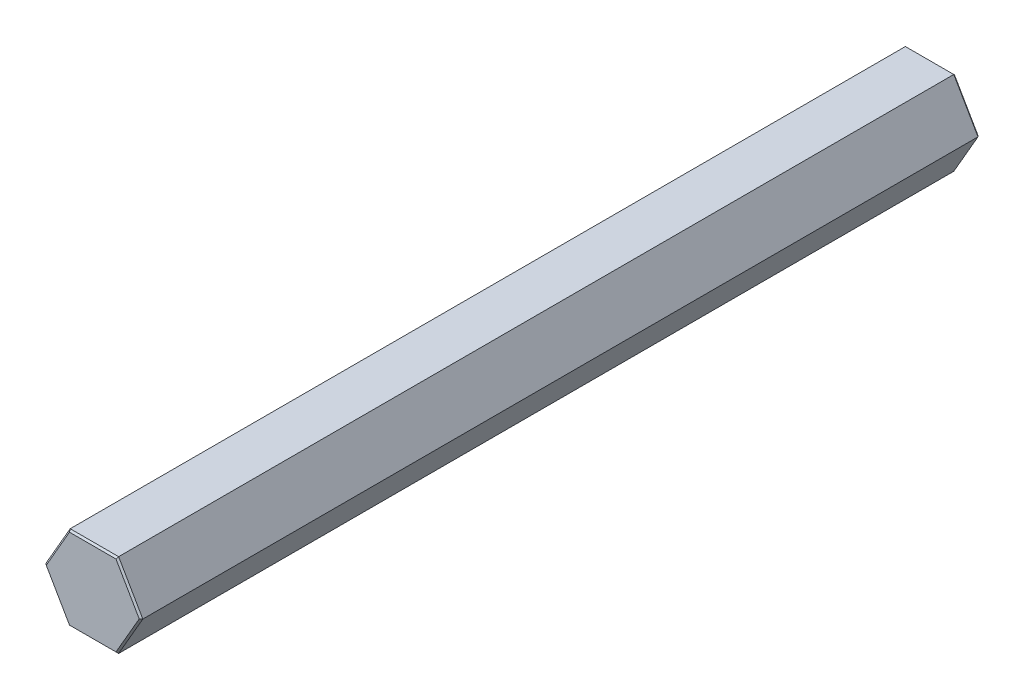
ISO-10303-21;
HEADER;
FILE_DESCRIPTION(('STEP AP214'),'2;1');
FILE_NAME('part.step','',(''),(''),'','','');
FILE_SCHEMA(('AUTOMOTIVE_DESIGN { 1 0 10303 214 1 1 1 1 }'));
ENDSEC;
DATA;
#1=APPLICATION_CONTEXT('core data for automotive mechanical design processes');
#2=APPLICATION_PROTOCOL_DEFINITION('international standard','automotive_design',2000,#1);
#3=PRODUCT_CONTEXT('',#1,'mechanical');
#4=PRODUCT('Part','Part','',(#3));
#5=PRODUCT_RELATED_PRODUCT_CATEGORY('part','',(#4));
#6=PRODUCT_DEFINITION_FORMATION('','',#4);
#7=PRODUCT_DEFINITION_CONTEXT('part definition',#1,'design');
#8=PRODUCT_DEFINITION('design','',#6,#7);
#9=PRODUCT_DEFINITION_SHAPE('','',#8);
#10=(LENGTH_UNIT() NAMED_UNIT(*) SI_UNIT(.MILLI.,.METRE.));
#11=(NAMED_UNIT(*) PLANE_ANGLE_UNIT() SI_UNIT($,.RADIAN.));
#12=(NAMED_UNIT(*) SI_UNIT($,.STERADIAN.) SOLID_ANGLE_UNIT());
#13=UNCERTAINTY_MEASURE_WITH_UNIT(LENGTH_MEASURE(1.E-05),#10,'distance_accuracy_value','');
#14=(GEOMETRIC_REPRESENTATION_CONTEXT(3) GLOBAL_UNCERTAINTY_ASSIGNED_CONTEXT((#13)) GLOBAL_UNIT_ASSIGNED_CONTEXT((#10,
#11,#12)) REPRESENTATION_CONTEXT('',''));
#15=CARTESIAN_POINT('',(0.,0.,0.));
#16=DIRECTION('',(0.,0.,1.));
#17=DIRECTION('',(1.,0.,0.));
#18=AXIS2_PLACEMENT_3D('',#15,#16,#17);
#19=CARTESIAN_POINT('',(-3.66617420935412,-6.35,0.));
#20=DIRECTION('',(0.,-1.,0.));
#21=DIRECTION('',(1.,0.,0.));
#22=AXIS2_PLACEMENT_3D('',#19,#20,#21);
#23=PLANE('',#22);
#24=DIRECTION('',(0.,0.,1.));
#25=VECTOR('',#24,1.);
#26=CARTESIAN_POINT('',(-3.66617420935412,-6.35,0.));
#27=LINE('',#26,#25);
#28=CARTESIAN_POINT('',(-3.66617420935412,-6.35,0.254000000000032));
#29=VERTEX_POINT('',#28);
#30=CARTESIAN_POINT('',(-3.66617420935412,-6.35,126.746));
#31=VERTEX_POINT('',#30);
#32=EDGE_CURVE('E169',#29,#31,#27,.T.);
#33=ORIENTED_EDGE('',*,*,#32,.F.);
#34=DIRECTION('',(1.,0.,0.));
#35=VECTOR('',#34,1.);
#36=CARTESIAN_POINT('',(3.66617420935413,-6.35,0.254000000000032));
#37=LINE('',#36,#35);
#38=CARTESIAN_POINT('',(3.66617420935413,-6.35,0.254000000000032));
#39=VERTEX_POINT('',#38);
#40=EDGE_CURVE('E196',#29,#39,#37,.T.);
#41=ORIENTED_EDGE('',*,*,#40,.T.);
#42=DIRECTION('',(0.,0.,1.));
#43=VECTOR('',#42,1.);
#44=CARTESIAN_POINT('',(3.66617420935413,-6.35,0.));
#45=LINE('',#44,#43);
#46=CARTESIAN_POINT('',(3.66617420935413,-6.35,126.746));
#47=VERTEX_POINT('',#46);
#48=EDGE_CURVE('E217',#39,#47,#45,.T.);
#49=ORIENTED_EDGE('',*,*,#48,.T.);
#50=DIRECTION('',(-1.,0.,0.));
#51=VECTOR('',#50,1.);
#52=CARTESIAN_POINT('',(-3.66617420935412,-6.35,126.746));
#53=LINE('',#52,#51);
#54=EDGE_CURVE('E194',#47,#31,#53,.T.);
#55=ORIENTED_EDGE('',*,*,#54,.T.);
#56=EDGE_LOOP('',(#33,#41,#49,#55));
#57=FACE_BOUND('',#56,.T.);
#58=ADVANCED_FACE('F33',(#57),#23,.T.);
#59=CARTESIAN_POINT('',(-7.33234841870824,0.,0.));
#60=DIRECTION('',(-0.866025403784438,-0.5,0.));
#61=DIRECTION('',(0.5,-0.866025403784439,0.));
#62=AXIS2_PLACEMENT_3D('',#59,#60,#61);
#63=PLANE('',#62);
#64=DIRECTION('',(0.,0.,1.));
#65=VECTOR('',#64,1.);
#66=CARTESIAN_POINT('',(-7.33234841870824,0.,0.));
#67=LINE('',#66,#65);
#68=CARTESIAN_POINT('',(-7.33234841870824,0.,0.254000000000032));
#69=VERTEX_POINT('',#68);
#70=CARTESIAN_POINT('',(-7.33234841870824,0.,126.746));
#71=VERTEX_POINT('',#70);
#72=EDGE_CURVE('E253',#69,#71,#67,.T.);
#73=ORIENTED_EDGE('',*,*,#72,.F.);
#74=DIRECTION('',(0.5,-0.866025403784439,0.));
#75=VECTOR('',#74,1.);
#76=CARTESIAN_POINT('',(-3.66617420935412,-6.35,0.254000000000032));
#77=LINE('',#76,#75);
#78=EDGE_CURVE('E188',#69,#29,#77,.T.);
#79=ORIENTED_EDGE('',*,*,#78,.T.);
#80=ORIENTED_EDGE('',*,*,#32,.T.);
#81=DIRECTION('',(-0.5,0.866025403784439,0.));
#82=VECTOR('',#81,1.);
#83=CARTESIAN_POINT('',(-7.33234841870824,0.,126.746));
#84=LINE('',#83,#82);
#85=EDGE_CURVE('E138',#31,#71,#84,.T.);
#86=ORIENTED_EDGE('',*,*,#85,.T.);
#87=EDGE_LOOP('',(#73,#79,#80,#86));
#88=FACE_BOUND('',#87,.T.);
#89=ADVANCED_FACE('F259',(#88),#63,.T.);
#90=CARTESIAN_POINT('',(-3.66617420935412,6.35,0.));
#91=DIRECTION('',(-0.866025403784438,0.5,0.));
#92=DIRECTION('',(-0.5,-0.866025403784439,0.));
#93=AXIS2_PLACEMENT_3D('',#90,#91,#92);
#94=PLANE('',#93);
#95=DIRECTION('',(0.,0.,1.));
#96=VECTOR('',#95,1.);
#97=CARTESIAN_POINT('',(-3.66617420935412,6.35,0.));
#98=LINE('',#97,#96);
#99=CARTESIAN_POINT('',(-3.66617420935412,6.35,0.254000000000032));
#100=VERTEX_POINT('',#99);
#101=CARTESIAN_POINT('',(-3.66617420935412,6.35,126.746));
#102=VERTEX_POINT('',#101);
#103=EDGE_CURVE('E150',#100,#102,#98,.T.);
#104=ORIENTED_EDGE('',*,*,#103,.F.);
#105=DIRECTION('',(-0.5,-0.866025403784439,0.));
#106=VECTOR('',#105,1.);
#107=CARTESIAN_POINT('',(-7.33234841870824,0.,0.254000000000032));
#108=LINE('',#107,#106);
#109=EDGE_CURVE('E184',#100,#69,#108,.T.);
#110=ORIENTED_EDGE('',*,*,#109,.T.);
#111=ORIENTED_EDGE('',*,*,#72,.T.);
#112=DIRECTION('',(0.5,0.866025403784439,0.));
#113=VECTOR('',#112,1.);
#114=CARTESIAN_POINT('',(-3.66617420935412,6.35,126.746));
#115=LINE('',#114,#113);
#116=EDGE_CURVE('E181',#71,#102,#115,.T.);
#117=ORIENTED_EDGE('',*,*,#116,.T.);
#118=EDGE_LOOP('',(#104,#110,#111,#117));
#119=FACE_BOUND('',#118,.T.);
#120=ADVANCED_FACE('F270',(#119),#94,.T.);
#121=CARTESIAN_POINT('',(3.66617420935412,6.35,0.));
#122=DIRECTION('',(0.,1.,0.));
#123=DIRECTION('',(0.,0.,1.));
#124=AXIS2_PLACEMENT_3D('',#121,#122,#123);
#125=PLANE('',#124);
#126=DIRECTION('',(0.,0.,1.));
#127=VECTOR('',#126,1.);
#128=CARTESIAN_POINT('',(3.66617420935412,6.35,0.));
#129=LINE('',#128,#127);
#130=CARTESIAN_POINT('',(3.66617420935412,6.35,0.254000000000032));
#131=VERTEX_POINT('',#130);
#132=CARTESIAN_POINT('',(3.66617420935412,6.35,126.746));
#133=VERTEX_POINT('',#132);
#134=EDGE_CURVE('E130',#131,#133,#129,.T.);
#135=ORIENTED_EDGE('',*,*,#134,.F.);
#136=DIRECTION('',(-1.,0.,0.));
#137=VECTOR('',#136,1.);
#138=CARTESIAN_POINT('',(-3.66617420935412,6.35,0.254000000000032));
#139=LINE('',#138,#137);
#140=EDGE_CURVE('E146',#131,#100,#139,.T.);
#141=ORIENTED_EDGE('',*,*,#140,.T.);
#142=ORIENTED_EDGE('',*,*,#103,.T.);
#143=DIRECTION('',(1.,0.,0.));
#144=VECTOR('',#143,1.);
#145=CARTESIAN_POINT('',(3.66617420935412,6.35,126.746));
#146=LINE('',#145,#144);
#147=EDGE_CURVE('E149',#102,#133,#146,.T.);
#148=ORIENTED_EDGE('',*,*,#147,.T.);
#149=EDGE_LOOP('',(#135,#141,#142,#148));
#150=FACE_BOUND('',#149,.T.);
#151=ADVANCED_FACE('F143',(#150),#125,.T.);
#152=CARTESIAN_POINT('',(7.33234841870825,0.,0.));
#153=DIRECTION('',(0.866025403784438,0.5,0.));
#154=DIRECTION('',(-0.5,0.866025403784439,0.));
#155=AXIS2_PLACEMENT_3D('',#152,#153,#154);
#156=PLANE('',#155);
#157=DIRECTION('',(0.,0.,1.));
#158=VECTOR('',#157,1.);
#159=CARTESIAN_POINT('',(7.33234841870825,0.,0.));
#160=LINE('',#159,#158);
#161=CARTESIAN_POINT('',(7.33234841870825,0.,0.254000000000032));
#162=VERTEX_POINT('',#161);
#163=CARTESIAN_POINT('',(7.33234841870825,0.,126.746));
#164=VERTEX_POINT('',#163);
#165=EDGE_CURVE('E133',#162,#164,#160,.T.);
#166=ORIENTED_EDGE('',*,*,#165,.F.);
#167=DIRECTION('',(-0.5,0.866025403784439,0.));
#168=VECTOR('',#167,1.);
#169=CARTESIAN_POINT('',(3.66617420935412,6.35,0.254000000000032));
#170=LINE('',#169,#168);
#171=EDGE_CURVE('E127',#162,#131,#170,.T.);
#172=ORIENTED_EDGE('',*,*,#171,.T.);
#173=ORIENTED_EDGE('',*,*,#134,.T.);
#174=DIRECTION('',(0.5,-0.866025403784439,0.));
#175=VECTOR('',#174,1.);
#176=CARTESIAN_POINT('',(7.33234841870825,0.,126.746));
#177=LINE('',#176,#175);
#178=EDGE_CURVE('E139',#133,#164,#177,.T.);
#179=ORIENTED_EDGE('',*,*,#178,.T.);
#180=EDGE_LOOP('',(#166,#172,#173,#179));
#181=FACE_BOUND('',#180,.T.);
#182=ADVANCED_FACE('F129',(#181),#156,.T.);
#183=CARTESIAN_POINT('',(3.66617420935413,-6.35,0.));
#184=DIRECTION('',(0.866025403784439,-0.5,0.));
#185=DIRECTION('',(0.5,0.866025403784439,0.));
#186=AXIS2_PLACEMENT_3D('',#183,#184,#185);
#187=PLANE('',#186);
#188=ORIENTED_EDGE('',*,*,#48,.F.);
#189=DIRECTION('',(0.5,0.866025403784439,0.));
#190=VECTOR('',#189,1.);
#191=CARTESIAN_POINT('',(7.33234841870825,0.,0.254000000000032));
#192=LINE('',#191,#190);
#193=EDGE_CURVE('E192',#39,#162,#192,.T.);
#194=ORIENTED_EDGE('',*,*,#193,.T.);
#195=ORIENTED_EDGE('',*,*,#165,.T.);
#196=DIRECTION('',(-0.5,-0.866025403784439,0.));
#197=VECTOR('',#196,1.);
#198=CARTESIAN_POINT('',(3.66617420935413,-6.35,126.746));
#199=LINE('',#198,#197);
#200=EDGE_CURVE('E190',#164,#47,#199,.T.);
#201=ORIENTED_EDGE('',*,*,#200,.T.);
#202=EDGE_LOOP('',(#188,#194,#195,#201));
#203=FACE_BOUND('',#202,.T.);
#204=ADVANCED_FACE('F244',(#203),#187,.T.);
#205=CARTESIAN_POINT('',(0.,0.,0.));
#206=DIRECTION('',(0.,0.,1.));
#207=DIRECTION('',(1.,0.,0.));
#208=AXIS2_PLACEMENT_3D('',#205,#206,#207);
#209=PLANE('',#208);
#210=DIRECTION('',(0.5,0.866025403784439,0.));
#211=VECTOR('',#210,1.);
#212=CARTESIAN_POINT('',(-3.44620375679286,6.22299999999999,0.));
#213=LINE('',#212,#211);
#214=CARTESIAN_POINT('',(-7.03905448195989,0.,0.));
#215=VERTEX_POINT('',#214);
#216=CARTESIAN_POINT('',(-3.51952724097994,6.09599999999998,0.));
#217=VERTEX_POINT('',#216);
#218=EDGE_CURVE('E177',#215,#217,#213,.T.);
#219=ORIENTED_EDGE('',*,*,#218,.T.);
#220=DIRECTION('',(1.,0.,0.));
#221=VECTOR('',#220,1.);
#222=CARTESIAN_POINT('',(3.66617420935412,6.09599999999998,0.));
#223=LINE('',#222,#221);
#224=CARTESIAN_POINT('',(3.51952724097995,6.09599999999998,0.));
#225=VERTEX_POINT('',#224);
#226=EDGE_CURVE('E179',#217,#225,#223,.T.);
#227=ORIENTED_EDGE('',*,*,#226,.T.);
#228=DIRECTION('',(0.5,-0.866025403784438,0.));
#229=VECTOR('',#228,1.);
#230=CARTESIAN_POINT('',(7.11237796614699,-0.127000000000007,0.));
#231=LINE('',#230,#229);
#232=CARTESIAN_POINT('',(7.0390544819599,0.,0.));
#233=VERTEX_POINT('',#232);
#234=EDGE_CURVE('E155',#225,#233,#231,.T.);
#235=ORIENTED_EDGE('',*,*,#234,.T.);
#236=DIRECTION('',(-0.5,-0.866025403784439,0.));
#237=VECTOR('',#236,1.);
#238=CARTESIAN_POINT('',(3.44620375679286,-6.22299999999999,0.));
#239=LINE('',#238,#237);
#240=CARTESIAN_POINT('',(3.51952724097995,-6.09599999999998,0.));
#241=VERTEX_POINT('',#240);
#242=EDGE_CURVE('E167',#233,#241,#239,.T.);
#243=ORIENTED_EDGE('',*,*,#242,.T.);
#244=DIRECTION('',(-1.,0.,0.));
#245=VECTOR('',#244,1.);
#246=CARTESIAN_POINT('',(-3.66617420935412,-6.09599999999998,0.));
#247=LINE('',#246,#245);
#248=CARTESIAN_POINT('',(-3.51952724097994,-6.09599999999998,0.));
#249=VERTEX_POINT('',#248);
#250=EDGE_CURVE('E165',#241,#249,#247,.T.);
#251=ORIENTED_EDGE('',*,*,#250,.T.);
#252=DIRECTION('',(-0.5,0.866025403784439,0.));
#253=VECTOR('',#252,1.);
#254=CARTESIAN_POINT('',(-7.11237796614698,0.127000000000011,0.));
#255=LINE('',#254,#253);
#256=EDGE_CURVE('E174',#249,#215,#255,.T.);
#257=ORIENTED_EDGE('',*,*,#256,.T.);
#258=EDGE_LOOP('',(#219,#227,#235,#243,#251,#257));
#259=FACE_BOUND('',#258,.T.);
#260=ADVANCED_FACE('F280',(#259),#209,.F.);
#261=CARTESIAN_POINT('',(0.,0.,127.));
#262=DIRECTION('',(0.,0.,1.));
#263=DIRECTION('',(1.,0.,0.));
#264=AXIS2_PLACEMENT_3D('',#261,#262,#263);
#265=PLANE('',#264);
#266=DIRECTION('',(-1.,0.,0.));
#267=VECTOR('',#266,1.);
#268=CARTESIAN_POINT('',(0.,6.09599999999996,127.));
#269=LINE('',#268,#267);
#270=CARTESIAN_POINT('',(3.51952724097994,6.09599999999996,127.));
#271=VERTEX_POINT('',#270);
#272=CARTESIAN_POINT('',(-3.51952724097993,6.09599999999996,127.));
#273=VERTEX_POINT('',#272);
#274=EDGE_CURVE('E57',#271,#273,#269,.T.);
#275=ORIENTED_EDGE('',*,*,#274,.T.);
#276=DIRECTION('',(-0.5,-0.866025403784439,0.));
#277=VECTOR('',#276,1.);
#278=CARTESIAN_POINT('',(-5.2792908614699,3.04799999999998,127.));
#279=LINE('',#278,#277);
#280=CARTESIAN_POINT('',(-7.03905448195987,0.,127.));
#281=VERTEX_POINT('',#280);
#282=EDGE_CURVE('E11',#273,#281,#279,.T.);
#283=ORIENTED_EDGE('',*,*,#282,.T.);
#284=DIRECTION('',(0.5,-0.866025403784439,0.));
#285=VECTOR('',#284,1.);
#286=CARTESIAN_POINT('',(-5.2792908614699,-3.04799999999998,127.));
#287=LINE('',#286,#285);
#288=CARTESIAN_POINT('',(-3.51952724097993,-6.09599999999996,127.));
#289=VERTEX_POINT('',#288);
#290=EDGE_CURVE('E42',#281,#289,#287,.T.);
#291=ORIENTED_EDGE('',*,*,#290,.T.);
#292=DIRECTION('',(1.,0.,0.));
#293=VECTOR('',#292,1.);
#294=CARTESIAN_POINT('',(0.,-6.09599999999996,127.));
#295=LINE('',#294,#293);
#296=CARTESIAN_POINT('',(3.51952724097994,-6.09599999999996,127.));
#297=VERTEX_POINT('',#296);
#298=EDGE_CURVE('E202',#289,#297,#295,.T.);
#299=ORIENTED_EDGE('',*,*,#298,.T.);
#300=DIRECTION('',(0.5,0.866025403784439,0.));
#301=VECTOR('',#300,1.);
#302=CARTESIAN_POINT('',(5.27929086146991,-3.04799999999998,127.));
#303=LINE('',#302,#301);
#304=CARTESIAN_POINT('',(7.03905448195988,0.,127.));
#305=VERTEX_POINT('',#304);
#306=EDGE_CURVE('E198',#297,#305,#303,.T.);
#307=ORIENTED_EDGE('',*,*,#306,.T.);
#308=DIRECTION('',(-0.5,0.866025403784438,0.));
#309=VECTOR('',#308,1.);
#310=CARTESIAN_POINT('',(5.27929086146991,3.04799999999999,127.));
#311=LINE('',#310,#309);
#312=EDGE_CURVE('E200',#305,#271,#311,.T.);
#313=ORIENTED_EDGE('',*,*,#312,.T.);
#314=EDGE_LOOP('',(#275,#283,#291,#299,#307,#313));
#315=FACE_BOUND('',#314,.T.);
#316=ADVANCED_FACE('F265',(#315),#265,.T.);
#317=CARTESIAN_POINT('',(-3.66617420935412,-6.35,0.254000000000032));
#318=DIRECTION('',(0.,-0.707106781186567,-0.707106781186528));
#319=DIRECTION('',(-1.,0.,0.));
#320=AXIS2_PLACEMENT_3D('',#317,#318,#319);
#321=PLANE('',#320);
#322=DIRECTION('',(0.377964473009221,0.65465367070796,-0.654653670707997));
#323=VECTOR('',#322,1.);
#324=CARTESIAN_POINT('',(-3.66617420935412,-6.35,0.254000000000032));
#325=LINE('',#324,#323);
#326=EDGE_CURVE('E211',#249,#29,#325,.F.);
#327=ORIENTED_EDGE('',*,*,#326,.F.);
#328=ORIENTED_EDGE('',*,*,#250,.F.);
#329=DIRECTION('',(0.377964473009218,-0.654653670707961,0.654653670707998));
#330=VECTOR('',#329,1.);
#331=CARTESIAN_POINT('',(2.61869586382443,-4.53571428571438,-1.56028571428569));
#332=LINE('',#331,#330);
#333=EDGE_CURVE('E214',#39,#241,#332,.F.);
#334=ORIENTED_EDGE('',*,*,#333,.F.);
#335=ORIENTED_EDGE('',*,*,#40,.F.);
#336=EDGE_LOOP('',(#327,#328,#334,#335));
#337=FACE_BOUND('',#336,.T.);
#338=ADVANCED_FACE('F284',(#337),#321,.T.);
#339=CARTESIAN_POINT('',(3.66617420935413,-6.35,0.254000000000032));
#340=DIRECTION('',(0.612372435695812,-0.353553390593284,-0.707106781186527));
#341=DIRECTION('',(-0.5,-0.866025403784439,0.));
#342=AXIS2_PLACEMENT_3D('',#339,#340,#341);
#343=PLANE('',#342);
#344=ORIENTED_EDGE('',*,*,#333,.T.);
#345=ORIENTED_EDGE('',*,*,#242,.F.);
#346=DIRECTION('',(0.755928946018436,0.,0.654653670707999));
#347=VECTOR('',#346,1.);
#348=CARTESIAN_POINT('',(5.23739172764886,0.,-1.56028571428569));
#349=LINE('',#348,#347);
#350=EDGE_CURVE('E209',#162,#233,#349,.F.);
#351=ORIENTED_EDGE('',*,*,#350,.F.);
#352=ORIENTED_EDGE('',*,*,#193,.F.);
#353=EDGE_LOOP('',(#344,#345,#351,#352));
#354=FACE_BOUND('',#353,.T.);
#355=ADVANCED_FACE('F287',(#354),#343,.T.);
#356=CARTESIAN_POINT('',(-7.33234841870824,0.,0.254000000000032));
#357=DIRECTION('',(-0.61237243569581,-0.353553390593283,-0.707106781186529));
#358=DIRECTION('',(-0.5,0.866025403784439,0.));
#359=AXIS2_PLACEMENT_3D('',#356,#357,#358);
#360=PLANE('',#359);
#361=ORIENTED_EDGE('',*,*,#326,.T.);
#362=ORIENTED_EDGE('',*,*,#78,.F.);
#363=DIRECTION('',(0.755928946018437,0.,-0.654653670707997));
#364=VECTOR('',#363,1.);
#365=CARTESIAN_POINT('',(-7.33234841870824,0.,0.254000000000032));
#366=LINE('',#365,#364);
#367=EDGE_CURVE('E159',#215,#69,#366,.F.);
#368=ORIENTED_EDGE('',*,*,#367,.F.);
#369=ORIENTED_EDGE('',*,*,#256,.F.);
#370=EDGE_LOOP('',(#361,#362,#368,#369));
#371=FACE_BOUND('',#370,.T.);
#372=ADVANCED_FACE('F273',(#371),#360,.T.);
#373=CARTESIAN_POINT('',(7.33234841870825,0.,0.254000000000032));
#374=DIRECTION('',(0.612372435695812,0.353553390593284,-0.707106781186527));
#375=DIRECTION('',(0.5,-0.866025403784439,0.));
#376=AXIS2_PLACEMENT_3D('',#373,#374,#375);
#377=PLANE('',#376);
#378=ORIENTED_EDGE('',*,*,#350,.T.);
#379=ORIENTED_EDGE('',*,*,#234,.F.);
#380=DIRECTION('',(0.377964473009215,0.654653670707963,0.654653670707999));
#381=VECTOR('',#380,1.);
#382=CARTESIAN_POINT('',(2.61869586382443,4.53571428571436,-1.56028571428571));
#383=LINE('',#382,#381);
#384=EDGE_CURVE('E153',#131,#225,#383,.F.);
#385=ORIENTED_EDGE('',*,*,#384,.F.);
#386=ORIENTED_EDGE('',*,*,#171,.F.);
#387=EDGE_LOOP('',(#378,#379,#385,#386));
#388=FACE_BOUND('',#387,.T.);
#389=ADVANCED_FACE('F154',(#388),#377,.T.);
#390=CARTESIAN_POINT('',(-3.66617420935412,6.35,0.254000000000032));
#391=DIRECTION('',(-0.612372435695812,0.353553390593284,-0.707106781186528));
#392=DIRECTION('',(0.5,0.866025403784439,0.));
#393=AXIS2_PLACEMENT_3D('',#390,#391,#392);
#394=PLANE('',#393);
#395=ORIENTED_EDGE('',*,*,#367,.T.);
#396=ORIENTED_EDGE('',*,*,#109,.F.);
#397=DIRECTION('',(0.377964473009217,-0.654653670707962,-0.654653670707998));
#398=VECTOR('',#397,1.);
#399=CARTESIAN_POINT('',(-3.66617420935412,6.35,0.254000000000032));
#400=LINE('',#399,#398);
#401=EDGE_CURVE('E160',#217,#100,#400,.F.);
#402=ORIENTED_EDGE('',*,*,#401,.F.);
#403=ORIENTED_EDGE('',*,*,#218,.F.);
#404=EDGE_LOOP('',(#395,#396,#402,#403));
#405=FACE_BOUND('',#404,.T.);
#406=ADVANCED_FACE('F278',(#405),#394,.T.);
#407=CARTESIAN_POINT('',(3.66617420935412,6.35,0.254000000000032));
#408=DIRECTION('',(0.,0.707106781186567,-0.707106781186528));
#409=DIRECTION('',(1.,0.,0.));
#410=AXIS2_PLACEMENT_3D('',#407,#408,#409);
#411=PLANE('',#410);
#412=ORIENTED_EDGE('',*,*,#384,.T.);
#413=ORIENTED_EDGE('',*,*,#226,.F.);
#414=ORIENTED_EDGE('',*,*,#401,.T.);
#415=ORIENTED_EDGE('',*,*,#140,.F.);
#416=EDGE_LOOP('',(#412,#413,#414,#415));
#417=FACE_BOUND('',#416,.T.);
#418=ADVANCED_FACE('F162',(#417),#411,.T.);
#419=CARTESIAN_POINT('',(5.27929086146991,-3.04799999999998,127.));
#420=DIRECTION('',(-0.612372435695789,0.353553390593271,-0.707106781186554));
#421=DIRECTION('',(0.5,0.866025403784439,0.));
#422=AXIS2_PLACEMENT_3D('',#419,#420,#421);
#423=PLANE('',#422);
#424=DIRECTION('',(0.37796447300923,-0.654653670707983,-0.65465367070797));
#425=VECTOR('',#424,1.);
#426=CARTESIAN_POINT('',(3.01673763512566,-5.22514285714281,127.870857142857));
#427=LINE('',#426,#425);
#428=EDGE_CURVE('E226',#47,#297,#427,.F.);
#429=ORIENTED_EDGE('',*,*,#428,.F.);
#430=ORIENTED_EDGE('',*,*,#200,.F.);
#431=DIRECTION('',(-0.75592894601846,0.,0.654653670707971));
#432=VECTOR('',#431,1.);
#433=CARTESIAN_POINT('',(6.03347527025131,0.,127.870857142857));
#434=LINE('',#433,#432);
#435=EDGE_CURVE('E37',#305,#164,#434,.F.);
#436=ORIENTED_EDGE('',*,*,#435,.F.);
#437=ORIENTED_EDGE('',*,*,#306,.F.);
#438=EDGE_LOOP('',(#429,#430,#436,#437));
#439=FACE_BOUND('',#438,.T.);
#440=ADVANCED_FACE('F35',(#439),#423,.F.);
#441=CARTESIAN_POINT('',(5.27929086146991,3.04799999999998,127.));
#442=DIRECTION('',(-0.612372435695789,-0.353553390593271,-0.707106781186553));
#443=DIRECTION('',(-0.5,0.866025403784439,0.));
#444=AXIS2_PLACEMENT_3D('',#441,#442,#443);
#445=PLANE('',#444);
#446=ORIENTED_EDGE('',*,*,#435,.T.);
#447=ORIENTED_EDGE('',*,*,#178,.F.);
#448=DIRECTION('',(-0.377964473009229,-0.654653670707982,0.654653670707971));
#449=VECTOR('',#448,1.);
#450=CARTESIAN_POINT('',(3.01673763512566,5.22514285714281,127.870857142857));
#451=LINE('',#450,#449);
#452=EDGE_CURVE('E224',#271,#133,#451,.F.);
#453=ORIENTED_EDGE('',*,*,#452,.F.);
#454=ORIENTED_EDGE('',*,*,#312,.F.);
#455=EDGE_LOOP('',(#446,#447,#453,#454));
#456=FACE_BOUND('',#455,.T.);
#457=ADVANCED_FACE('F236',(#456),#445,.F.);
#458=CARTESIAN_POINT('',(0.,-6.09599999999996,127.));
#459=DIRECTION('',(0.,0.707106781186541,-0.707106781186554));
#460=DIRECTION('',(1.,0.,0.));
#461=AXIS2_PLACEMENT_3D('',#458,#459,#460);
#462=PLANE('',#461);
#463=ORIENTED_EDGE('',*,*,#428,.T.);
#464=ORIENTED_EDGE('',*,*,#298,.F.);
#465=DIRECTION('',(-0.377964473009231,-0.654653670707982,-0.65465367070797));
#466=VECTOR('',#465,1.);
#467=CARTESIAN_POINT('',(-3.01673763512565,-5.22514285714281,127.870857142857));
#468=LINE('',#467,#466);
#469=EDGE_CURVE('E221',#31,#289,#468,.F.);
#470=ORIENTED_EDGE('',*,*,#469,.F.);
#471=ORIENTED_EDGE('',*,*,#54,.F.);
#472=EDGE_LOOP('',(#463,#464,#470,#471));
#473=FACE_BOUND('',#472,.T.);
#474=ADVANCED_FACE('F262',(#473),#462,.F.);
#475=CARTESIAN_POINT('',(0.,6.09599999999996,127.));
#476=DIRECTION('',(0.,-0.707106781186541,-0.707106781186554));
#477=DIRECTION('',(-1.,0.,0.));
#478=AXIS2_PLACEMENT_3D('',#475,#476,#477);
#479=PLANE('',#478);
#480=ORIENTED_EDGE('',*,*,#452,.T.);
#481=ORIENTED_EDGE('',*,*,#147,.F.);
#482=DIRECTION('',(0.377964473009232,-0.654653670707982,0.65465367070797));
#483=VECTOR('',#482,1.);
#484=CARTESIAN_POINT('',(-3.01673763512565,5.22514285714281,127.870857142857));
#485=LINE('',#484,#483);
#486=EDGE_CURVE('E219',#273,#102,#485,.F.);
#487=ORIENTED_EDGE('',*,*,#486,.F.);
#488=ORIENTED_EDGE('',*,*,#274,.F.);
#489=EDGE_LOOP('',(#480,#481,#487,#488));
#490=FACE_BOUND('',#489,.T.);
#491=ADVANCED_FACE('F268',(#490),#479,.F.);
#492=CARTESIAN_POINT('',(-5.2792908614699,-3.04799999999998,127.));
#493=DIRECTION('',(0.612372435695788,0.353553390593271,-0.707106781186554));
#494=DIRECTION('',(0.5,-0.866025403784439,0.));
#495=AXIS2_PLACEMENT_3D('',#492,#493,#494);
#496=PLANE('',#495);
#497=ORIENTED_EDGE('',*,*,#469,.T.);
#498=ORIENTED_EDGE('',*,*,#290,.F.);
#499=DIRECTION('',(-0.755928946018461,0.,-0.65465367070797));
#500=VECTOR('',#499,1.);
#501=CARTESIAN_POINT('',(-6.0334752702513,0.,127.870857142857));
#502=LINE('',#501,#500);
#503=EDGE_CURVE('E50',#71,#281,#502,.F.);
#504=ORIENTED_EDGE('',*,*,#503,.F.);
#505=ORIENTED_EDGE('',*,*,#85,.F.);
#506=EDGE_LOOP('',(#497,#498,#504,#505));
#507=FACE_BOUND('',#506,.T.);
#508=ADVANCED_FACE('F264',(#507),#496,.F.);
#509=CARTESIAN_POINT('',(-5.2792908614699,3.04799999999998,127.));
#510=DIRECTION('',(0.612372435695788,-0.353553390593271,-0.707106781186554));
#511=DIRECTION('',(-0.5,-0.866025403784439,0.));
#512=AXIS2_PLACEMENT_3D('',#509,#510,#511);
#513=PLANE('',#512);
#514=ORIENTED_EDGE('',*,*,#486,.T.);
#515=ORIENTED_EDGE('',*,*,#116,.F.);
#516=ORIENTED_EDGE('',*,*,#503,.T.);
#517=ORIENTED_EDGE('',*,*,#282,.F.);
#518=EDGE_LOOP('',(#514,#515,#516,#517));
#519=FACE_BOUND('',#518,.T.);
#520=ADVANCED_FACE('F266',(#519),#513,.F.);
#521=CLOSED_SHELL('',(#58,#89,#120,#151,#182,#204,#260,#316,#338,#355,#372,#389,#406,#418,#440,
#457,#474,#491,#508,#520));
#522=MANIFOLD_SOLID_BREP('B2',#521);
#523=ADVANCED_BREP_SHAPE_REPRESENTATION('',(#18,#522),#14);
#524=SHAPE_DEFINITION_REPRESENTATION(#9,#523);
ENDSEC;
END-ISO-10303-21;
